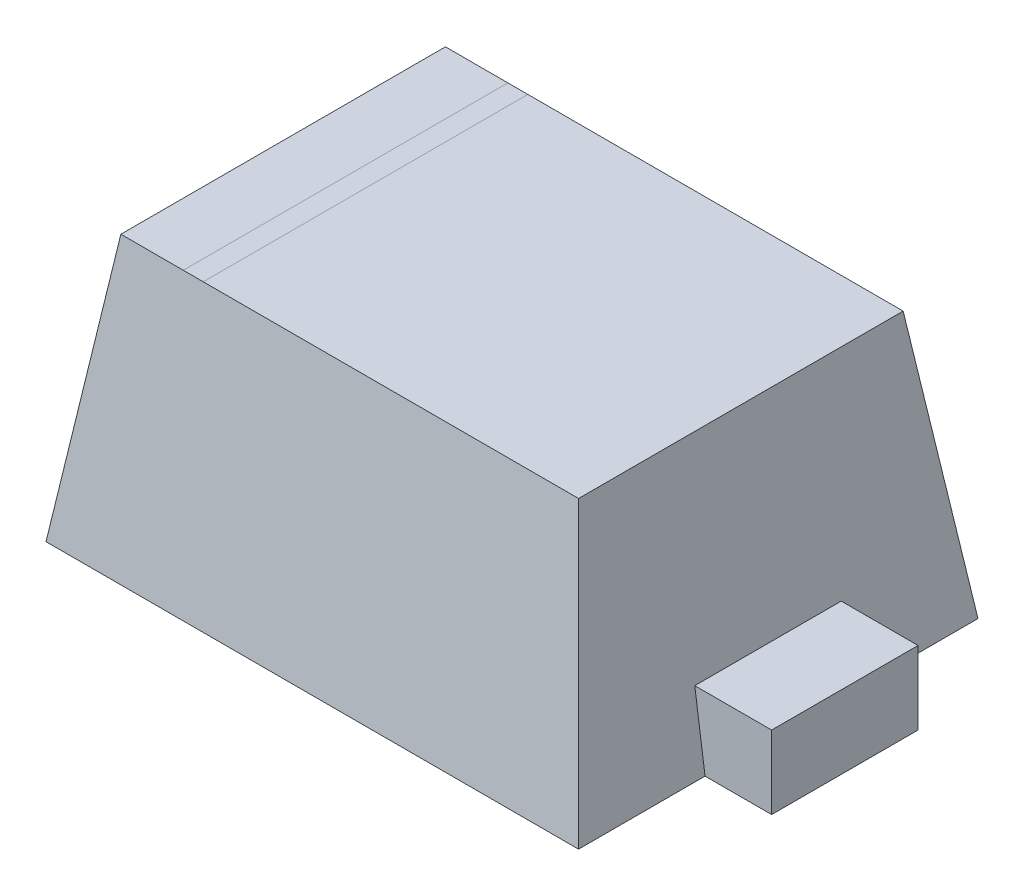
ISO-10303-21;
HEADER;
FILE_DESCRIPTION(('STEP AP214'),'2;1');
FILE_NAME('part.step','',(''),(''),'','','');
FILE_SCHEMA(('AUTOMOTIVE_DESIGN { 1 0 10303 214 1 1 1 1 }'));
ENDSEC;
DATA;
#1=APPLICATION_CONTEXT('core data for automotive mechanical design processes');
#2=APPLICATION_PROTOCOL_DEFINITION('international standard','automotive_design',2000,#1);
#3=PRODUCT_CONTEXT('',#1,'mechanical');
#4=PRODUCT('Part','Part','',(#3));
#5=PRODUCT_RELATED_PRODUCT_CATEGORY('part','',(#4));
#6=PRODUCT_DEFINITION_FORMATION('','',#4);
#7=PRODUCT_DEFINITION_CONTEXT('part definition',#1,'design');
#8=PRODUCT_DEFINITION('design','',#6,#7);
#9=PRODUCT_DEFINITION_SHAPE('','',#8);
#10=(LENGTH_UNIT() NAMED_UNIT(*) SI_UNIT(.MILLI.,.METRE.));
#11=(NAMED_UNIT(*) PLANE_ANGLE_UNIT() SI_UNIT($,.RADIAN.));
#12=(NAMED_UNIT(*) SI_UNIT($,.STERADIAN.) SOLID_ANGLE_UNIT());
#13=UNCERTAINTY_MEASURE_WITH_UNIT(LENGTH_MEASURE(1.E-05),#10,'distance_accuracy_value','');
#14=(GEOMETRIC_REPRESENTATION_CONTEXT(3) GLOBAL_UNCERTAINTY_ASSIGNED_CONTEXT((#13)) GLOBAL_UNIT_ASSIGNED_CONTEXT((#10,
#11,#12)) REPRESENTATION_CONTEXT('',''));
#15=CARTESIAN_POINT('',(0.,0.,0.));
#16=DIRECTION('',(0.,0.,1.));
#17=DIRECTION('',(1.,0.,0.));
#18=AXIS2_PLACEMENT_3D('',#15,#16,#17);
#19=CARTESIAN_POINT('',(-0.4,0.4,0.3));
#20=DIRECTION('',(0.,1.,0.));
#21=DIRECTION('',(0.,0.,1.));
#22=AXIS2_PLACEMENT_3D('',#19,#20,#21);
#23=PLANE('',#22);
#24=DIRECTION('',(1.,0.,0.));
#25=VECTOR('',#24,1.);
#26=CARTESIAN_POINT('',(-0.4,0.4,0.243783666119));
#27=LINE('',#26,#25);
#28=CARTESIAN_POINT('',(-0.343783666119,0.4,0.243783666119));
#29=VERTEX_POINT('',#28);
#30=CARTESIAN_POINT('',(-0.25,0.4,0.243783666119));
#31=VERTEX_POINT('',#30);
#32=EDGE_CURVE('P0_E11',#29,#31,#27,.T.);
#33=ORIENTED_EDGE('',*,*,#32,.T.);
#34=DIRECTION('',(0.,0.,-1.));
#35=VECTOR('',#34,1.);
#36=CARTESIAN_POINT('',(-0.25,0.4,0.3));
#37=LINE('',#36,#35);
#38=CARTESIAN_POINT('',(-0.25,0.4,-0.243783666119));
#39=VERTEX_POINT('',#38);
#40=EDGE_CURVE('P0_E25',#31,#39,#37,.T.);
#41=ORIENTED_EDGE('',*,*,#40,.T.);
#42=DIRECTION('',(-1.,0.,0.));
#43=VECTOR('',#42,1.);
#44=CARTESIAN_POINT('',(-0.4,0.4,-0.243783666119));
#45=LINE('',#44,#43);
#46=CARTESIAN_POINT('',(-0.343783666119,0.4,-0.243783666119));
#47=VERTEX_POINT('',#46);
#48=EDGE_CURVE('P0_E139',#39,#47,#45,.T.);
#49=ORIENTED_EDGE('',*,*,#48,.T.);
#50=DIRECTION('',(0.,0.,1.));
#51=VECTOR('',#50,1.);
#52=CARTESIAN_POINT('',(-0.343783666119,0.4,-0.3));
#53=LINE('',#52,#51);
#54=EDGE_CURVE('P0_E135',#47,#29,#53,.T.);
#55=ORIENTED_EDGE('',*,*,#54,.T.);
#56=EDGE_LOOP('',(#33,#41,#49,#55));
#57=FACE_BOUND('',#56,.T.);
#58=ADVANCED_FACE('P0_F17',(#57),#23,.T.);
#59=CARTESIAN_POINT('',(-0.4,0.,-0.3));
#60=DIRECTION('',(-0.990268068741588,0.139173100959942,0.));
#61=DIRECTION('',(-0.139173100959942,-0.990268068741588,0.));
#62=AXIS2_PLACEMENT_3D('',#59,#60,#61);
#63=PLANE('',#62);
#64=DIRECTION('',(0.,0.,1.));
#65=VECTOR('',#64,1.);
#66=CARTESIAN_POINT('',(-0.4,0.,-0.3));
#67=LINE('',#66,#65);
#68=CARTESIAN_POINT('',(-0.4,0.,-0.3));
#69=VERTEX_POINT('',#68);
#70=CARTESIAN_POINT('',(-0.4,0.,0.3));
#71=VERTEX_POINT('',#70);
#72=EDGE_CURVE('P0_E131',#69,#71,#67,.T.);
#73=ORIENTED_EDGE('',*,*,#72,.T.);
#74=DIRECTION('',(-0.137844537491984,-0.980814848463889,0.137844537491984));
#75=VECTOR('',#74,1.);
#76=CARTESIAN_POINT('',(-0.4,0.,0.3));
#77=LINE('',#76,#75);
#78=EDGE_CURVE('P0_E126',#29,#71,#77,.T.);
#79=ORIENTED_EDGE('',*,*,#78,.F.);
#80=ORIENTED_EDGE('',*,*,#54,.F.);
#81=DIRECTION('',(-0.137844537491984,-0.980814848463889,-0.137844537491984));
#82=VECTOR('',#81,1.);
#83=CARTESIAN_POINT('',(-0.4,0.,-0.3));
#84=LINE('',#83,#82);
#85=EDGE_CURVE('P0_E122',#47,#69,#84,.T.);
#86=ORIENTED_EDGE('',*,*,#85,.T.);
#87=EDGE_LOOP('',(#73,#79,#80,#86));
#88=FACE_BOUND('',#87,.T.);
#89=ADVANCED_FACE('P0_F156',(#88),#63,.T.);
#90=CARTESIAN_POINT('',(-0.4,0.,-0.3));
#91=DIRECTION('',(0.,0.139173100959942,-0.990268068741588));
#92=DIRECTION('',(0.,0.990268068741588,0.139173100959942));
#93=AXIS2_PLACEMENT_3D('',#90,#91,#92);
#94=PLANE('',#93);
#95=DIRECTION('',(-1.,0.,0.));
#96=VECTOR('',#95,1.);
#97=CARTESIAN_POINT('',(-0.4,0.,-0.3));
#98=LINE('',#97,#96);
#99=CARTESIAN_POINT('',(0.4,0.,-0.3));
#100=VERTEX_POINT('',#99);
#101=EDGE_CURVE('P0_E117',#100,#69,#98,.T.);
#102=ORIENTED_EDGE('',*,*,#101,.T.);
#103=ORIENTED_EDGE('',*,*,#85,.F.);
#104=ORIENTED_EDGE('',*,*,#48,.F.);
#105=DIRECTION('',(-1.,0.,0.));
#106=VECTOR('',#105,1.);
#107=CARTESIAN_POINT('',(-0.4,0.4,-0.243783666119));
#108=LINE('',#107,#106);
#109=CARTESIAN_POINT('',(-0.22,0.4,-0.243783666119));
#110=VERTEX_POINT('',#109);
#111=EDGE_CURVE('P0_E113',#110,#39,#108,.T.);
#112=ORIENTED_EDGE('',*,*,#111,.F.);
#113=DIRECTION('',(-1.,0.,0.));
#114=VECTOR('',#113,1.);
#115=CARTESIAN_POINT('',(-0.4,0.4,-0.243783666119));
#116=LINE('',#115,#114);
#117=CARTESIAN_POINT('',(0.343783666119,0.4,-0.243783666119));
#118=VERTEX_POINT('',#117);
#119=EDGE_CURVE('P0_E81',#118,#110,#116,.T.);
#120=ORIENTED_EDGE('',*,*,#119,.F.);
#121=DIRECTION('',(0.137844537491984,-0.980814848463889,-0.137844537491984));
#122=VECTOR('',#121,1.);
#123=CARTESIAN_POINT('',(0.384799106787,0.108159975321,-0.284799106787));
#124=LINE('',#123,#122);
#125=EDGE_CURVE('P0_E106',#118,#100,#124,.T.);
#126=ORIENTED_EDGE('',*,*,#125,.T.);
#127=EDGE_LOOP('',(#102,#103,#104,#112,#120,#126));
#128=FACE_BOUND('',#127,.T.);
#129=ADVANCED_FACE('P0_F152',(#128),#94,.T.);
#130=CARTESIAN_POINT('',(0.4,0.,-0.3));
#131=DIRECTION('',(0.990268068741588,0.139173100959942,0.));
#132=DIRECTION('',(-0.139173100959942,0.990268068741588,0.));
#133=AXIS2_PLACEMENT_3D('',#130,#131,#132);
#134=PLANE('',#133);
#135=DIRECTION('',(0.,0.,-1.));
#136=VECTOR('',#135,1.);
#137=CARTESIAN_POINT('',(0.4,0.,-0.3));
#138=LINE('',#137,#136);
#139=CARTESIAN_POINT('',(0.4,0.,0.3));
#140=VERTEX_POINT('',#139);
#141=EDGE_CURVE('P0_E101',#140,#100,#138,.T.);
#142=ORIENTED_EDGE('',*,*,#141,.T.);
#143=ORIENTED_EDGE('',*,*,#125,.F.);
#144=DIRECTION('',(0.,0.,-1.));
#145=VECTOR('',#144,1.);
#146=CARTESIAN_POINT('',(0.343783666119,0.4,-0.3));
#147=LINE('',#146,#145);
#148=CARTESIAN_POINT('',(0.343783666119,0.4,0.243783666119));
#149=VERTEX_POINT('',#148);
#150=EDGE_CURVE('P0_E97',#149,#118,#147,.T.);
#151=ORIENTED_EDGE('',*,*,#150,.F.);
#152=DIRECTION('',(0.137844537491984,-0.980814848463889,0.137844537491984));
#153=VECTOR('',#152,1.);
#154=CARTESIAN_POINT('',(0.38859933009,0.08111998149086,0.28859933009));
#155=LINE('',#154,#153);
#156=EDGE_CURVE('P0_E72',#149,#140,#155,.T.);
#157=ORIENTED_EDGE('',*,*,#156,.T.);
#158=EDGE_LOOP('',(#142,#143,#151,#157));
#159=FACE_BOUND('',#158,.T.);
#160=ADVANCED_FACE('P0_F163',(#159),#134,.T.);
#161=CARTESIAN_POINT('',(-0.4,0.,0.3));
#162=DIRECTION('',(0.,0.139173100959942,0.990268068741588));
#163=DIRECTION('',(0.,-0.990268068741588,0.139173100959942));
#164=AXIS2_PLACEMENT_3D('',#161,#162,#163);
#165=PLANE('',#164);
#166=DIRECTION('',(1.,0.,0.));
#167=VECTOR('',#166,1.);
#168=CARTESIAN_POINT('',(-0.4,0.,0.3));
#169=LINE('',#168,#167);
#170=EDGE_CURVE('P0_E75',#71,#140,#169,.T.);
#171=ORIENTED_EDGE('',*,*,#170,.T.);
#172=ORIENTED_EDGE('',*,*,#156,.F.);
#173=DIRECTION('',(1.,0.,0.));
#174=VECTOR('',#173,1.);
#175=CARTESIAN_POINT('',(-0.4,0.4,0.243783666119));
#176=LINE('',#175,#174);
#177=CARTESIAN_POINT('',(-0.22,0.4,0.243783666119));
#178=VERTEX_POINT('',#177);
#179=EDGE_CURVE('P0_E66',#178,#149,#176,.T.);
#180=ORIENTED_EDGE('',*,*,#179,.F.);
#181=DIRECTION('',(1.,0.,0.));
#182=VECTOR('',#181,1.);
#183=CARTESIAN_POINT('',(-0.4,0.4,0.243783666119));
#184=LINE('',#183,#182);
#185=EDGE_CURVE('P0_E71',#31,#178,#184,.T.);
#186=ORIENTED_EDGE('',*,*,#185,.F.);
#187=ORIENTED_EDGE('',*,*,#32,.F.);
#188=ORIENTED_EDGE('',*,*,#78,.T.);
#189=EDGE_LOOP('',(#171,#172,#180,#186,#187,#188));
#190=FACE_BOUND('',#189,.T.);
#191=ADVANCED_FACE('P0_F69',(#190),#165,.T.);
#192=CARTESIAN_POINT('',(-0.4,0.4,0.3));
#193=DIRECTION('',(0.,1.,0.));
#194=DIRECTION('',(0.,0.,1.));
#195=AXIS2_PLACEMENT_3D('',#192,#193,#194);
#196=PLANE('',#195);
#197=ORIENTED_EDGE('',*,*,#40,.F.);
#198=ORIENTED_EDGE('',*,*,#185,.T.);
#199=DIRECTION('',(0.,0.,1.));
#200=VECTOR('',#199,1.);
#201=CARTESIAN_POINT('',(-0.22,0.4,0.3));
#202=LINE('',#201,#200);
#203=EDGE_CURVE('P0_E79',#110,#178,#202,.T.);
#204=ORIENTED_EDGE('',*,*,#203,.F.);
#205=ORIENTED_EDGE('',*,*,#111,.T.);
#206=EDGE_LOOP('',(#197,#198,#204,#205));
#207=FACE_BOUND('',#206,.T.);
#208=ADVANCED_FACE('P0_F84',(#207),#196,.T.);
#209=CARTESIAN_POINT('',(-0.4,0.4,0.3));
#210=DIRECTION('',(0.,1.,0.));
#211=DIRECTION('',(0.,0.,1.));
#212=AXIS2_PLACEMENT_3D('',#209,#210,#211);
#213=PLANE('',#212);
#214=ORIENTED_EDGE('',*,*,#119,.T.);
#215=ORIENTED_EDGE('',*,*,#203,.T.);
#216=ORIENTED_EDGE('',*,*,#179,.T.);
#217=ORIENTED_EDGE('',*,*,#150,.T.);
#218=EDGE_LOOP('',(#214,#215,#216,#217));
#219=FACE_BOUND('',#218,.T.);
#220=ADVANCED_FACE('P0_F80',(#219),#213,.T.);
#221=CARTESIAN_POINT('',(-0.4,0.,0.3));
#222=DIRECTION('',(0.,1.,0.));
#223=DIRECTION('',(0.,0.,1.));
#224=AXIS2_PLACEMENT_3D('',#221,#222,#223);
#225=PLANE('',#224);
#226=ORIENTED_EDGE('',*,*,#72,.F.);
#227=ORIENTED_EDGE('',*,*,#101,.F.);
#228=ORIENTED_EDGE('',*,*,#141,.F.);
#229=ORIENTED_EDGE('',*,*,#170,.F.);
#230=EDGE_LOOP('',(#226,#227,#228,#229));
#231=FACE_BOUND('',#230,.T.);
#232=ADVANCED_FACE('P0_F160',(#231),#225,.F.);
#233=CLOSED_SHELL('',(#58,#89,#129,#160,#191,#208,#220,#232));
#234=MANIFOLD_SOLID_BREP('P0_B1',#233);
#235=CARTESIAN_POINT('',(0.32,0.11,-0.11));
#236=DIRECTION('',(1.,0.,0.));
#237=DIRECTION('',(0.,0.,-1.));
#238=AXIS2_PLACEMENT_3D('',#235,#236,#237);
#239=PLANE('',#238);
#240=DIRECTION('',(0.,0.,1.));
#241=VECTOR('',#240,1.);
#242=CARTESIAN_POINT('',(0.32,0.,-0.11));
#243=LINE('',#242,#241);
#244=CARTESIAN_POINT('',(0.32,0.,-0.11));
#245=VERTEX_POINT('',#244);
#246=CARTESIAN_POINT('',(0.32,0.,0.11));
#247=VERTEX_POINT('',#246);
#248=EDGE_CURVE('P1_E11',#245,#247,#243,.T.);
#249=ORIENTED_EDGE('',*,*,#248,.T.);
#250=DIRECTION('',(0.,-1.,0.));
#251=VECTOR('',#250,1.);
#252=CARTESIAN_POINT('',(0.32,0.11,0.11));
#253=LINE('',#252,#251);
#254=CARTESIAN_POINT('',(0.32,0.11,0.11));
#255=VERTEX_POINT('',#254);
#256=EDGE_CURVE('P1_E25',#255,#247,#253,.T.);
#257=ORIENTED_EDGE('',*,*,#256,.F.);
#258=DIRECTION('',(0.,0.,1.));
#259=VECTOR('',#258,1.);
#260=CARTESIAN_POINT('',(0.32,0.11,-0.11));
#261=LINE('',#260,#259);
#262=CARTESIAN_POINT('',(0.32,0.11,-0.11));
#263=VERTEX_POINT('',#262);
#264=EDGE_CURVE('P1_E95',#263,#255,#261,.T.);
#265=ORIENTED_EDGE('',*,*,#264,.F.);
#266=DIRECTION('',(0.,-1.,0.));
#267=VECTOR('',#266,1.);
#268=CARTESIAN_POINT('',(0.32,0.11,-0.11));
#269=LINE('',#268,#267);
#270=EDGE_CURVE('P1_E91',#263,#245,#269,.T.);
#271=ORIENTED_EDGE('',*,*,#270,.T.);
#272=EDGE_LOOP('',(#249,#257,#265,#271));
#273=FACE_BOUND('',#272,.T.);
#274=ADVANCED_FACE('P1_F17',(#273),#239,.F.);
#275=CARTESIAN_POINT('',(0.32,0.11,-0.11));
#276=DIRECTION('',(0.,0.,1.));
#277=DIRECTION('',(1.,0.,0.));
#278=AXIS2_PLACEMENT_3D('',#275,#276,#277);
#279=PLANE('',#278);
#280=DIRECTION('',(-1.,0.,0.));
#281=VECTOR('',#280,1.);
#282=CARTESIAN_POINT('',(0.32,0.,-0.11));
#283=LINE('',#282,#281);
#284=CARTESIAN_POINT('',(0.5,0.,-0.11));
#285=VERTEX_POINT('',#284);
#286=EDGE_CURVE('P1_E73',#285,#245,#283,.T.);
#287=ORIENTED_EDGE('',*,*,#286,.T.);
#288=ORIENTED_EDGE('',*,*,#270,.F.);
#289=DIRECTION('',(-1.,0.,0.));
#290=VECTOR('',#289,1.);
#291=CARTESIAN_POINT('',(0.32,0.11,-0.11));
#292=LINE('',#291,#290);
#293=CARTESIAN_POINT('',(0.5,0.11,-0.11));
#294=VERTEX_POINT('',#293);
#295=EDGE_CURVE('P1_E76',#294,#263,#292,.T.);
#296=ORIENTED_EDGE('',*,*,#295,.F.);
#297=DIRECTION('',(0.,-1.,0.));
#298=VECTOR('',#297,1.);
#299=CARTESIAN_POINT('',(0.5,0.11,-0.11));
#300=LINE('',#299,#298);
#301=EDGE_CURVE('P1_E74',#294,#285,#300,.T.);
#302=ORIENTED_EDGE('',*,*,#301,.T.);
#303=EDGE_LOOP('',(#287,#288,#296,#302));
#304=FACE_BOUND('',#303,.T.);
#305=ADVANCED_FACE('P1_F108',(#304),#279,.F.);
#306=CARTESIAN_POINT('',(0.5,0.11,-0.11));
#307=DIRECTION('',(-1.,0.,0.));
#308=DIRECTION('',(0.,0.,1.));
#309=AXIS2_PLACEMENT_3D('',#306,#307,#308);
#310=PLANE('',#309);
#311=DIRECTION('',(0.,0.,-1.));
#312=VECTOR('',#311,1.);
#313=CARTESIAN_POINT('',(0.5,0.,-0.11));
#314=LINE('',#313,#312);
#315=CARTESIAN_POINT('',(0.5,0.,0.11));
#316=VERTEX_POINT('',#315);
#317=EDGE_CURVE('P1_E59',#316,#285,#314,.T.);
#318=ORIENTED_EDGE('',*,*,#317,.T.);
#319=ORIENTED_EDGE('',*,*,#301,.F.);
#320=DIRECTION('',(0.,0.,-1.));
#321=VECTOR('',#320,1.);
#322=CARTESIAN_POINT('',(0.5,0.11,-0.11));
#323=LINE('',#322,#321);
#324=CARTESIAN_POINT('',(0.5,0.11,0.11));
#325=VERTEX_POINT('',#324);
#326=EDGE_CURVE('P1_E62',#325,#294,#323,.T.);
#327=ORIENTED_EDGE('',*,*,#326,.F.);
#328=DIRECTION('',(0.,-1.,0.));
#329=VECTOR('',#328,1.);
#330=CARTESIAN_POINT('',(0.5,0.11,0.11));
#331=LINE('',#330,#329);
#332=EDGE_CURVE('P1_E54',#325,#316,#331,.T.);
#333=ORIENTED_EDGE('',*,*,#332,.T.);
#334=EDGE_LOOP('',(#318,#319,#327,#333));
#335=FACE_BOUND('',#334,.T.);
#336=ADVANCED_FACE('P1_F56',(#335),#310,.F.);
#337=CARTESIAN_POINT('',(0.32,0.11,0.11));
#338=DIRECTION('',(0.,0.,-1.));
#339=DIRECTION('',(-1.,0.,0.));
#340=AXIS2_PLACEMENT_3D('',#337,#338,#339);
#341=PLANE('',#340);
#342=DIRECTION('',(1.,0.,0.));
#343=VECTOR('',#342,1.);
#344=CARTESIAN_POINT('',(0.32,0.,0.11));
#345=LINE('',#344,#343);
#346=EDGE_CURVE('P1_E65',#247,#316,#345,.T.);
#347=ORIENTED_EDGE('',*,*,#346,.T.);
#348=ORIENTED_EDGE('',*,*,#332,.F.);
#349=DIRECTION('',(1.,0.,0.));
#350=VECTOR('',#349,1.);
#351=CARTESIAN_POINT('',(0.32,0.11,0.11));
#352=LINE('',#351,#350);
#353=EDGE_CURVE('P1_E69',#255,#325,#352,.T.);
#354=ORIENTED_EDGE('',*,*,#353,.F.);
#355=ORIENTED_EDGE('',*,*,#256,.T.);
#356=EDGE_LOOP('',(#347,#348,#354,#355));
#357=FACE_BOUND('',#356,.T.);
#358=ADVANCED_FACE('P1_F67',(#357),#341,.F.);
#359=CARTESIAN_POINT('',(0.32,0.11,0.11));
#360=DIRECTION('',(0.,1.,0.));
#361=DIRECTION('',(0.,0.,1.));
#362=AXIS2_PLACEMENT_3D('',#359,#360,#361);
#363=PLANE('',#362);
#364=ORIENTED_EDGE('',*,*,#264,.T.);
#365=ORIENTED_EDGE('',*,*,#353,.T.);
#366=ORIENTED_EDGE('',*,*,#326,.T.);
#367=ORIENTED_EDGE('',*,*,#295,.T.);
#368=EDGE_LOOP('',(#364,#365,#366,#367));
#369=FACE_BOUND('',#368,.T.);
#370=ADVANCED_FACE('P1_F105',(#369),#363,.T.);
#371=CARTESIAN_POINT('',(0.32,0.,0.11));
#372=DIRECTION('',(0.,1.,0.));
#373=DIRECTION('',(0.,0.,1.));
#374=AXIS2_PLACEMENT_3D('',#371,#372,#373);
#375=PLANE('',#374);
#376=ORIENTED_EDGE('',*,*,#248,.F.);
#377=ORIENTED_EDGE('',*,*,#286,.F.);
#378=ORIENTED_EDGE('',*,*,#317,.F.);
#379=ORIENTED_EDGE('',*,*,#346,.F.);
#380=EDGE_LOOP('',(#376,#377,#378,#379));
#381=FACE_BOUND('',#380,.T.);
#382=ADVANCED_FACE('P1_F71',(#381),#375,.F.);
#383=CLOSED_SHELL('',(#274,#305,#336,#358,#370,#382));
#384=MANIFOLD_SOLID_BREP('P1_B1',#383);
#385=CARTESIAN_POINT('',(-0.32,0.11,-0.11));
#386=DIRECTION('',(0.,0.,1.));
#387=DIRECTION('',(1.,0.,0.));
#388=AXIS2_PLACEMENT_3D('',#385,#386,#387);
#389=PLANE('',#388);
#390=DIRECTION('',(-1.,0.,0.));
#391=VECTOR('',#390,1.);
#392=CARTESIAN_POINT('',(-0.32,0.,-0.11));
#393=LINE('',#392,#391);
#394=CARTESIAN_POINT('',(-0.32,0.,-0.11));
#395=VERTEX_POINT('',#394);
#396=CARTESIAN_POINT('',(-0.5,0.,-0.11));
#397=VERTEX_POINT('',#396);
#398=EDGE_CURVE('P2_E11',#395,#397,#393,.T.);
#399=ORIENTED_EDGE('',*,*,#398,.T.);
#400=DIRECTION('',(0.,-1.,0.));
#401=VECTOR('',#400,1.);
#402=CARTESIAN_POINT('',(-0.5,0.11,-0.11));
#403=LINE('',#402,#401);
#404=CARTESIAN_POINT('',(-0.5,0.11,-0.11));
#405=VERTEX_POINT('',#404);
#406=EDGE_CURVE('P2_E25',#405,#397,#403,.T.);
#407=ORIENTED_EDGE('',*,*,#406,.F.);
#408=DIRECTION('',(-1.,0.,0.));
#409=VECTOR('',#408,1.);
#410=CARTESIAN_POINT('',(-0.32,0.11,-0.11));
#411=LINE('',#410,#409);
#412=CARTESIAN_POINT('',(-0.32,0.11,-0.11));
#413=VERTEX_POINT('',#412);
#414=EDGE_CURVE('P2_E95',#413,#405,#411,.T.);
#415=ORIENTED_EDGE('',*,*,#414,.F.);
#416=DIRECTION('',(0.,-1.,0.));
#417=VECTOR('',#416,1.);
#418=CARTESIAN_POINT('',(-0.32,0.11,-0.11));
#419=LINE('',#418,#417);
#420=EDGE_CURVE('P2_E91',#413,#395,#419,.T.);
#421=ORIENTED_EDGE('',*,*,#420,.T.);
#422=EDGE_LOOP('',(#399,#407,#415,#421));
#423=FACE_BOUND('',#422,.T.);
#424=ADVANCED_FACE('P2_F17',(#423),#389,.F.);
#425=CARTESIAN_POINT('',(-0.32,0.11,-0.11));
#426=DIRECTION('',(-1.,0.,0.));
#427=DIRECTION('',(0.,0.,1.));
#428=AXIS2_PLACEMENT_3D('',#425,#426,#427);
#429=PLANE('',#428);
#430=DIRECTION('',(0.,0.,-1.));
#431=VECTOR('',#430,1.);
#432=CARTESIAN_POINT('',(-0.32,0.,-0.11));
#433=LINE('',#432,#431);
#434=CARTESIAN_POINT('',(-0.32,0.,0.11));
#435=VERTEX_POINT('',#434);
#436=EDGE_CURVE('P2_E73',#435,#395,#433,.T.);
#437=ORIENTED_EDGE('',*,*,#436,.T.);
#438=ORIENTED_EDGE('',*,*,#420,.F.);
#439=DIRECTION('',(0.,0.,-1.));
#440=VECTOR('',#439,1.);
#441=CARTESIAN_POINT('',(-0.32,0.11,-0.11));
#442=LINE('',#441,#440);
#443=CARTESIAN_POINT('',(-0.32,0.11,0.11));
#444=VERTEX_POINT('',#443);
#445=EDGE_CURVE('P2_E76',#444,#413,#442,.T.);
#446=ORIENTED_EDGE('',*,*,#445,.F.);
#447=DIRECTION('',(0.,-1.,0.));
#448=VECTOR('',#447,1.);
#449=CARTESIAN_POINT('',(-0.32,0.11,0.11));
#450=LINE('',#449,#448);
#451=EDGE_CURVE('P2_E74',#444,#435,#450,.T.);
#452=ORIENTED_EDGE('',*,*,#451,.T.);
#453=EDGE_LOOP('',(#437,#438,#446,#452));
#454=FACE_BOUND('',#453,.T.);
#455=ADVANCED_FACE('P2_F108',(#454),#429,.F.);
#456=CARTESIAN_POINT('',(-0.32,0.11,0.11));
#457=DIRECTION('',(0.,0.,-1.));
#458=DIRECTION('',(-1.,0.,0.));
#459=AXIS2_PLACEMENT_3D('',#456,#457,#458);
#460=PLANE('',#459);
#461=DIRECTION('',(1.,0.,0.));
#462=VECTOR('',#461,1.);
#463=CARTESIAN_POINT('',(-0.32,0.,0.11));
#464=LINE('',#463,#462);
#465=CARTESIAN_POINT('',(-0.5,0.,0.11));
#466=VERTEX_POINT('',#465);
#467=EDGE_CURVE('P2_E59',#466,#435,#464,.T.);
#468=ORIENTED_EDGE('',*,*,#467,.T.);
#469=ORIENTED_EDGE('',*,*,#451,.F.);
#470=DIRECTION('',(1.,0.,0.));
#471=VECTOR('',#470,1.);
#472=CARTESIAN_POINT('',(-0.32,0.11,0.11));
#473=LINE('',#472,#471);
#474=CARTESIAN_POINT('',(-0.5,0.11,0.11));
#475=VERTEX_POINT('',#474);
#476=EDGE_CURVE('P2_E62',#475,#444,#473,.T.);
#477=ORIENTED_EDGE('',*,*,#476,.F.);
#478=DIRECTION('',(0.,-1.,0.));
#479=VECTOR('',#478,1.);
#480=CARTESIAN_POINT('',(-0.5,0.11,0.11));
#481=LINE('',#480,#479);
#482=EDGE_CURVE('P2_E54',#475,#466,#481,.T.);
#483=ORIENTED_EDGE('',*,*,#482,.T.);
#484=EDGE_LOOP('',(#468,#469,#477,#483));
#485=FACE_BOUND('',#484,.T.);
#486=ADVANCED_FACE('P2_F56',(#485),#460,.F.);
#487=CARTESIAN_POINT('',(-0.5,0.11,-0.11));
#488=DIRECTION('',(1.,0.,0.));
#489=DIRECTION('',(0.,0.,-1.));
#490=AXIS2_PLACEMENT_3D('',#487,#488,#489);
#491=PLANE('',#490);
#492=DIRECTION('',(0.,0.,1.));
#493=VECTOR('',#492,1.);
#494=CARTESIAN_POINT('',(-0.5,0.,-0.11));
#495=LINE('',#494,#493);
#496=EDGE_CURVE('P2_E65',#397,#466,#495,.T.);
#497=ORIENTED_EDGE('',*,*,#496,.T.);
#498=ORIENTED_EDGE('',*,*,#482,.F.);
#499=DIRECTION('',(0.,0.,1.));
#500=VECTOR('',#499,1.);
#501=CARTESIAN_POINT('',(-0.5,0.11,-0.11));
#502=LINE('',#501,#500);
#503=EDGE_CURVE('P2_E69',#405,#475,#502,.T.);
#504=ORIENTED_EDGE('',*,*,#503,.F.);
#505=ORIENTED_EDGE('',*,*,#406,.T.);
#506=EDGE_LOOP('',(#497,#498,#504,#505));
#507=FACE_BOUND('',#506,.T.);
#508=ADVANCED_FACE('P2_F67',(#507),#491,.F.);
#509=CARTESIAN_POINT('',(-0.5,0.11,-0.11));
#510=DIRECTION('',(0.,1.,0.));
#511=DIRECTION('',(0.,0.,1.));
#512=AXIS2_PLACEMENT_3D('',#509,#510,#511);
#513=PLANE('',#512);
#514=ORIENTED_EDGE('',*,*,#414,.T.);
#515=ORIENTED_EDGE('',*,*,#503,.T.);
#516=ORIENTED_EDGE('',*,*,#476,.T.);
#517=ORIENTED_EDGE('',*,*,#445,.T.);
#518=EDGE_LOOP('',(#514,#515,#516,#517));
#519=FACE_BOUND('',#518,.T.);
#520=ADVANCED_FACE('P2_F105',(#519),#513,.T.);
#521=CARTESIAN_POINT('',(-0.5,0.,-0.11));
#522=DIRECTION('',(0.,1.,0.));
#523=DIRECTION('',(0.,0.,1.));
#524=AXIS2_PLACEMENT_3D('',#521,#522,#523);
#525=PLANE('',#524);
#526=ORIENTED_EDGE('',*,*,#398,.F.);
#527=ORIENTED_EDGE('',*,*,#436,.F.);
#528=ORIENTED_EDGE('',*,*,#467,.F.);
#529=ORIENTED_EDGE('',*,*,#496,.F.);
#530=EDGE_LOOP('',(#526,#527,#528,#529));
#531=FACE_BOUND('',#530,.T.);
#532=ADVANCED_FACE('P2_F71',(#531),#525,.F.);
#533=CLOSED_SHELL('',(#424,#455,#486,#508,#520,#532));
#534=MANIFOLD_SOLID_BREP('P2_B1',#533);
#535=ADVANCED_BREP_SHAPE_REPRESENTATION('',(#18,#234,#384,#534),#14);
#536=SHAPE_DEFINITION_REPRESENTATION(#9,#535);
ENDSEC;
END-ISO-10303-21;
